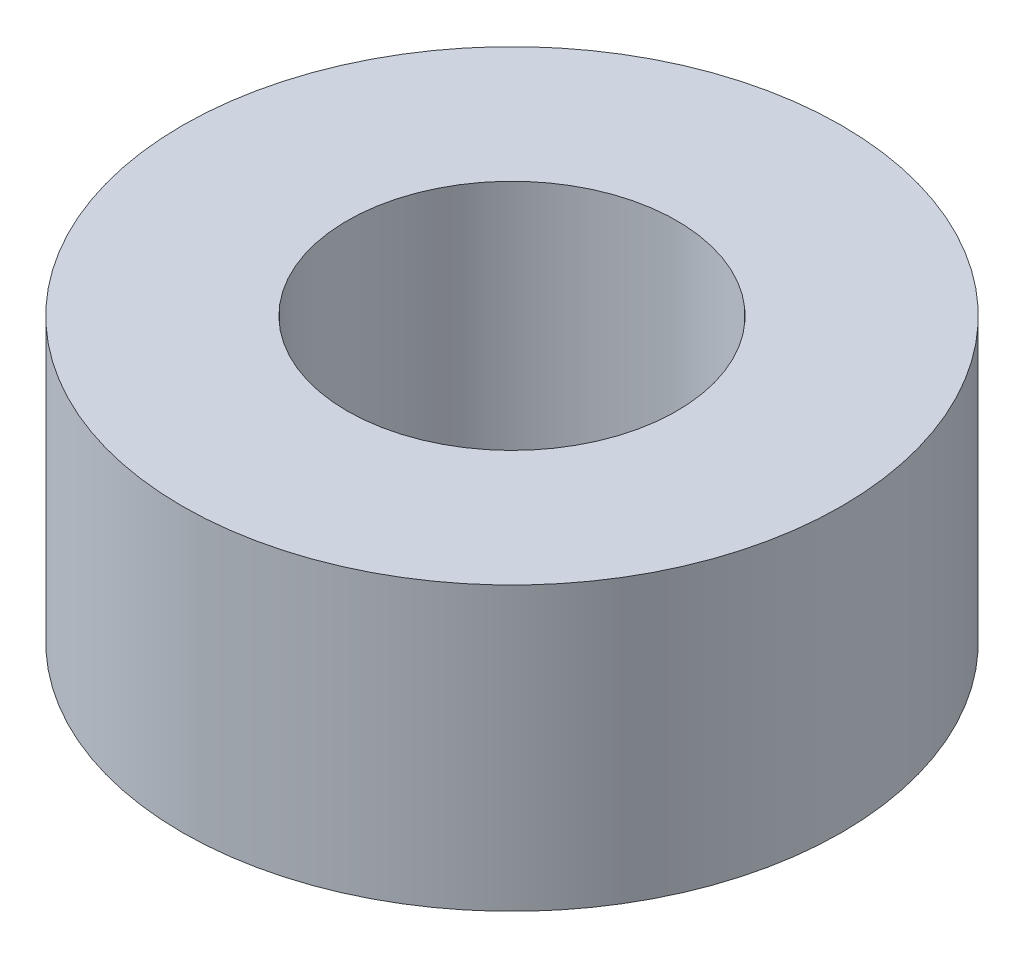
ISO-10303-21;
HEADER;
FILE_DESCRIPTION(('STEP AP214'),'2;1');
FILE_NAME('part.step','',(''),(''),'','','');
FILE_SCHEMA(('AUTOMOTIVE_DESIGN { 1 0 10303 214 1 1 1 1 }'));
ENDSEC;
DATA;
#1=APPLICATION_CONTEXT('core data for automotive mechanical design processes');
#2=APPLICATION_PROTOCOL_DEFINITION('international standard','automotive_design',2000,#1);
#3=PRODUCT_CONTEXT('',#1,'mechanical');
#4=PRODUCT('Part','Part','',(#3));
#5=PRODUCT_RELATED_PRODUCT_CATEGORY('part','',(#4));
#6=PRODUCT_DEFINITION_FORMATION('','',#4);
#7=PRODUCT_DEFINITION_CONTEXT('part definition',#1,'design');
#8=PRODUCT_DEFINITION('design','',#6,#7);
#9=PRODUCT_DEFINITION_SHAPE('','',#8);
#10=(LENGTH_UNIT() NAMED_UNIT(*) SI_UNIT(.MILLI.,.METRE.));
#11=(NAMED_UNIT(*) PLANE_ANGLE_UNIT() SI_UNIT($,.RADIAN.));
#12=(NAMED_UNIT(*) SI_UNIT($,.STERADIAN.) SOLID_ANGLE_UNIT());
#13=UNCERTAINTY_MEASURE_WITH_UNIT(LENGTH_MEASURE(1.E-05),#10,'distance_accuracy_value','');
#14=(GEOMETRIC_REPRESENTATION_CONTEXT(3) GLOBAL_UNCERTAINTY_ASSIGNED_CONTEXT((#13)) GLOBAL_UNIT_ASSIGNED_CONTEXT((#10,
#11,#12)) REPRESENTATION_CONTEXT('',''));
#15=CARTESIAN_POINT('',(0.,0.,0.));
#16=DIRECTION('',(0.,0.,1.));
#17=DIRECTION('',(1.,0.,0.));
#18=AXIS2_PLACEMENT_3D('',#15,#16,#17);
#19=CARTESIAN_POINT('',(0.,3.,0.));
#20=DIRECTION('',(0.,1.,0.));
#21=DIRECTION('',(0.,0.,1.));
#22=AXIS2_PLACEMENT_3D('',#19,#20,#21);
#23=PLANE('',#22);
#24=CARTESIAN_POINT('',(0.,3.,0.));
#25=DIRECTION('',(0.,1.,0.));
#26=DIRECTION('',(0.,0.,1.));
#27=AXIS2_PLACEMENT_3D('',#24,#25,#26);
#28=CIRCLE('',#27,3.5);
#29=CARTESIAN_POINT('',(0.,3.,3.5));
#30=VERTEX_POINT('',#29);
#31=EDGE_CURVE('E10',#30,#30,#28,.T.);
#32=ORIENTED_EDGE('',*,*,#31,.T.);
#33=EDGE_LOOP('',(#32));
#34=FACE_BOUND('',#33,.T.);
#35=CARTESIAN_POINT('',(0.,3.,0.));
#36=DIRECTION('',(0.,1.,0.));
#37=DIRECTION('',(0.,0.,1.));
#38=AXIS2_PLACEMENT_3D('',#35,#36,#37);
#39=CIRCLE('',#38,1.75);
#40=CARTESIAN_POINT('',(0.,3.,1.75));
#41=VERTEX_POINT('',#40);
#42=EDGE_CURVE('E44',#41,#41,#39,.T.);
#43=ORIENTED_EDGE('',*,*,#42,.F.);
#44=EDGE_LOOP('',(#43));
#45=FACE_BOUND('',#44,.T.);
#46=ADVANCED_FACE('F33',(#34,#45),#23,.T.);
#47=CARTESIAN_POINT('',(0.,0.,0.));
#48=DIRECTION('',(0.,1.,0.));
#49=DIRECTION('',(0.,0.,1.));
#50=AXIS2_PLACEMENT_3D('',#47,#48,#49);
#51=PLANE('',#50);
#52=CARTESIAN_POINT('',(0.,0.,0.));
#53=DIRECTION('',(0.,1.,0.));
#54=DIRECTION('',(0.,0.,1.));
#55=AXIS2_PLACEMENT_3D('',#52,#53,#54);
#56=CIRCLE('',#55,3.5);
#57=CARTESIAN_POINT('',(0.,0.,3.5));
#58=VERTEX_POINT('',#57);
#59=EDGE_CURVE('E37',#58,#58,#56,.T.);
#60=ORIENTED_EDGE('',*,*,#59,.F.);
#61=EDGE_LOOP('',(#60));
#62=FACE_BOUND('',#61,.T.);
#63=CARTESIAN_POINT('',(0.,0.,0.));
#64=DIRECTION('',(0.,1.,0.));
#65=DIRECTION('',(0.,0.,1.));
#66=AXIS2_PLACEMENT_3D('',#63,#64,#65);
#67=CIRCLE('',#66,1.75);
#68=CARTESIAN_POINT('',(0.,0.,1.75));
#69=VERTEX_POINT('',#68);
#70=EDGE_CURVE('E46',#69,#69,#67,.T.);
#71=ORIENTED_EDGE('',*,*,#70,.T.);
#72=EDGE_LOOP('',(#71));
#73=FACE_BOUND('',#72,.T.);
#74=ADVANCED_FACE('F56',(#62,#73),#51,.F.);
#75=CARTESIAN_POINT('',(0.,3.,0.));
#76=DIRECTION('',(0.,-1.,0.));
#77=DIRECTION('',(0.,0.,-1.));
#78=AXIS2_PLACEMENT_3D('',#75,#76,#77);
#79=CYLINDRICAL_SURFACE('',#78,3.5);
#80=ORIENTED_EDGE('',*,*,#31,.F.);
#81=EDGE_LOOP('',(#80));
#82=FACE_BOUND('',#81,.T.);
#83=ORIENTED_EDGE('',*,*,#59,.T.);
#84=EDGE_LOOP('',(#83));
#85=FACE_BOUND('',#84,.T.);
#86=ADVANCED_FACE('F35',(#82,#85),#79,.T.);
#87=CARTESIAN_POINT('',(0.,3.,0.));
#88=DIRECTION('',(0.,-1.,0.));
#89=DIRECTION('',(0.,0.,-1.));
#90=AXIS2_PLACEMENT_3D('',#87,#88,#89);
#91=CYLINDRICAL_SURFACE('',#90,1.75);
#92=ORIENTED_EDGE('',*,*,#42,.T.);
#93=EDGE_LOOP('',(#92));
#94=FACE_BOUND('',#93,.T.);
#95=ORIENTED_EDGE('',*,*,#70,.F.);
#96=EDGE_LOOP('',(#95));
#97=FACE_BOUND('',#96,.T.);
#98=ADVANCED_FACE('F52',(#94,#97),#91,.F.);
#99=CLOSED_SHELL('',(#46,#74,#86,#98));
#100=MANIFOLD_SOLID_BREP('B2',#99);
#101=ADVANCED_BREP_SHAPE_REPRESENTATION('',(#18,#100),#14);
#102=SHAPE_DEFINITION_REPRESENTATION(#9,#101);
ENDSEC;
END-ISO-10303-21;
